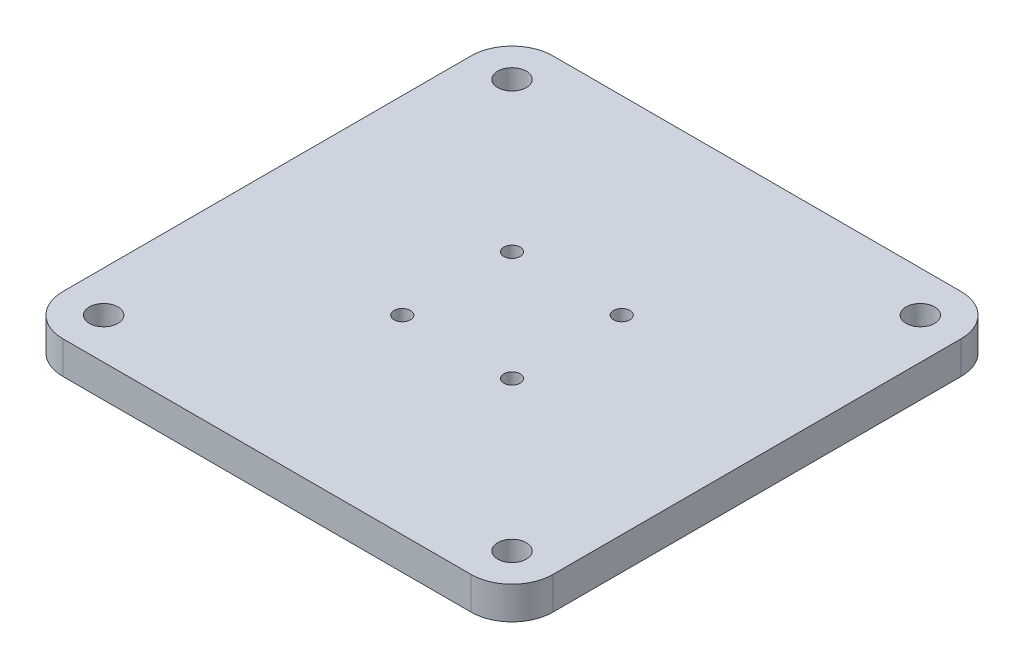
ISO-10303-21;
HEADER;
FILE_DESCRIPTION(('STEP AP214'),'2;1');
FILE_NAME('part.step','',(''),(''),'','','');
FILE_SCHEMA(('AUTOMOTIVE_DESIGN { 1 0 10303 214 1 1 1 1 }'));
ENDSEC;
DATA;
#1=APPLICATION_CONTEXT('core data for automotive mechanical design processes');
#2=APPLICATION_PROTOCOL_DEFINITION('international standard','automotive_design',2000,#1);
#3=PRODUCT_CONTEXT('',#1,'mechanical');
#4=PRODUCT('Part','Part','',(#3));
#5=PRODUCT_RELATED_PRODUCT_CATEGORY('part','',(#4));
#6=PRODUCT_DEFINITION_FORMATION('','',#4);
#7=PRODUCT_DEFINITION_CONTEXT('part definition',#1,'design');
#8=PRODUCT_DEFINITION('design','',#6,#7);
#9=PRODUCT_DEFINITION_SHAPE('','',#8);
#10=(LENGTH_UNIT() NAMED_UNIT(*) SI_UNIT(.MILLI.,.METRE.));
#11=(NAMED_UNIT(*) PLANE_ANGLE_UNIT() SI_UNIT($,.RADIAN.));
#12=(NAMED_UNIT(*) SI_UNIT($,.STERADIAN.) SOLID_ANGLE_UNIT());
#13=UNCERTAINTY_MEASURE_WITH_UNIT(LENGTH_MEASURE(1.E-05),#10,'distance_accuracy_value','');
#14=(GEOMETRIC_REPRESENTATION_CONTEXT(3) GLOBAL_UNCERTAINTY_ASSIGNED_CONTEXT((#13)) GLOBAL_UNIT_ASSIGNED_CONTEXT((#10,
#11,#12)) REPRESENTATION_CONTEXT('',''));
#15=CARTESIAN_POINT('',(0.,0.,0.));
#16=DIRECTION('',(0.,0.,1.));
#17=DIRECTION('',(1.,0.,0.));
#18=AXIS2_PLACEMENT_3D('',#15,#16,#17);
#19=CARTESIAN_POINT('',(-13.4350288425443,8.,-13.4350288425445));
#20=DIRECTION('',(0.,-1.,0.));
#21=DIRECTION('',(0.,0.,-1.));
#22=AXIS2_PLACEMENT_3D('',#19,#20,#21);
#23=CYLINDRICAL_SURFACE('',#22,2.);
#24=CARTESIAN_POINT('',(-13.4350288425443,8.,-13.4350288425445));
#25=DIRECTION('',(0.,1.,0.));
#26=DIRECTION('',(0.,0.,1.));
#27=AXIS2_PLACEMENT_3D('',#24,#25,#26);
#28=CIRCLE('',#27,2.);
#29=CARTESIAN_POINT('',(-13.4350288425443,8.,-11.4350288425445));
#30=VERTEX_POINT('',#29);
#31=EDGE_CURVE('E128',#30,#30,#28,.T.);
#32=ORIENTED_EDGE('',*,*,#31,.T.);
#33=EDGE_LOOP('',(#32));
#34=FACE_BOUND('',#33,.T.);
#35=CARTESIAN_POINT('',(-13.4350288425443,4.,-13.4350288425445));
#36=DIRECTION('',(0.,-1.,0.));
#37=DIRECTION('',(0.,0.,-1.));
#38=AXIS2_PLACEMENT_3D('',#35,#36,#37);
#39=CIRCLE('',#38,2.);
#40=CARTESIAN_POINT('',(-13.4350288425443,4.,-15.4350288425445));
#41=VERTEX_POINT('',#40);
#42=EDGE_CURVE('E167',#41,#41,#39,.T.);
#43=ORIENTED_EDGE('',*,*,#42,.T.);
#44=EDGE_LOOP('',(#43));
#45=FACE_BOUND('',#44,.T.);
#46=ADVANCED_FACE('F35',(#34,#45),#23,.F.);
#47=CARTESIAN_POINT('',(13.4350288425445,8.,-13.4350288425451));
#48=DIRECTION('',(0.,-1.,0.));
#49=DIRECTION('',(0.,0.,-1.));
#50=AXIS2_PLACEMENT_3D('',#47,#48,#49);
#51=CYLINDRICAL_SURFACE('',#50,2.00000000000078);
#52=CARTESIAN_POINT('',(13.4350288425445,8.,-13.4350288425451));
#53=DIRECTION('',(0.,1.,0.));
#54=DIRECTION('',(0.,0.,1.));
#55=AXIS2_PLACEMENT_3D('',#52,#53,#54);
#56=CIRCLE('',#55,2.00000000000078);
#57=CARTESIAN_POINT('',(13.4350288425445,8.,-11.4350288425443));
#58=VERTEX_POINT('',#57);
#59=EDGE_CURVE('E134',#58,#58,#56,.T.);
#60=ORIENTED_EDGE('',*,*,#59,.T.);
#61=EDGE_LOOP('',(#60));
#62=FACE_BOUND('',#61,.T.);
#63=CARTESIAN_POINT('',(13.4350288425445,4.,-13.4350288425451));
#64=DIRECTION('',(0.,-1.,0.));
#65=DIRECTION('',(0.,0.,-1.));
#66=AXIS2_PLACEMENT_3D('',#63,#64,#65);
#67=CIRCLE('',#66,2.00000000000078);
#68=CARTESIAN_POINT('',(13.4350288425445,4.,-15.4350288425459));
#69=VERTEX_POINT('',#68);
#70=EDGE_CURVE('E164',#69,#69,#67,.T.);
#71=ORIENTED_EDGE('',*,*,#70,.T.);
#72=EDGE_LOOP('',(#71));
#73=FACE_BOUND('',#72,.T.);
#74=ADVANCED_FACE('F292',(#62,#73),#51,.F.);
#75=CARTESIAN_POINT('',(13.4350288425451,8.,13.4350288425437));
#76=DIRECTION('',(0.,-1.,0.));
#77=DIRECTION('',(0.,0.,-1.));
#78=AXIS2_PLACEMENT_3D('',#75,#76,#77);
#79=CYLINDRICAL_SURFACE('',#78,2.00000000000106);
#80=CARTESIAN_POINT('',(13.4350288425451,8.,13.4350288425437));
#81=DIRECTION('',(0.,1.,0.));
#82=DIRECTION('',(0.,0.,1.));
#83=AXIS2_PLACEMENT_3D('',#80,#81,#82);
#84=CIRCLE('',#83,2.00000000000106);
#85=CARTESIAN_POINT('',(13.4350288425451,8.,15.4350288425448));
#86=VERTEX_POINT('',#85);
#87=EDGE_CURVE('E211',#86,#86,#84,.T.);
#88=ORIENTED_EDGE('',*,*,#87,.T.);
#89=EDGE_LOOP('',(#88));
#90=FACE_BOUND('',#89,.T.);
#91=CARTESIAN_POINT('',(13.4350288425451,4.,13.4350288425437));
#92=DIRECTION('',(0.,-1.,0.));
#93=DIRECTION('',(0.,0.,-1.));
#94=AXIS2_PLACEMENT_3D('',#91,#92,#93);
#95=CIRCLE('',#94,2.00000000000106);
#96=CARTESIAN_POINT('',(13.4350288425451,4.,11.4350288425427));
#97=VERTEX_POINT('',#96);
#98=EDGE_CURVE('E160',#97,#97,#95,.T.);
#99=ORIENTED_EDGE('',*,*,#98,.T.);
#100=EDGE_LOOP('',(#99));
#101=FACE_BOUND('',#100,.T.);
#102=ADVANCED_FACE('F298',(#90,#101),#79,.F.);
#103=CARTESIAN_POINT('',(-13.4350288425437,8.,13.4350288425443));
#104=DIRECTION('',(0.,-1.,0.));
#105=DIRECTION('',(0.,0.,-1.));
#106=AXIS2_PLACEMENT_3D('',#103,#104,#105);
#107=CYLINDRICAL_SURFACE('',#106,2.0000000000004);
#108=CARTESIAN_POINT('',(-13.4350288425437,8.,13.4350288425443));
#109=DIRECTION('',(0.,1.,0.));
#110=DIRECTION('',(0.,0.,1.));
#111=AXIS2_PLACEMENT_3D('',#108,#109,#110);
#112=CIRCLE('',#111,2.0000000000004);
#113=CARTESIAN_POINT('',(-13.4350288425437,8.,15.4350288425447));
#114=VERTEX_POINT('',#113);
#115=EDGE_CURVE('E156',#114,#114,#112,.T.);
#116=ORIENTED_EDGE('',*,*,#115,.T.);
#117=EDGE_LOOP('',(#116));
#118=FACE_BOUND('',#117,.T.);
#119=CARTESIAN_POINT('',(-13.4350288425437,4.,13.4350288425443));
#120=DIRECTION('',(0.,-1.,0.));
#121=DIRECTION('',(0.,0.,-1.));
#122=AXIS2_PLACEMENT_3D('',#119,#120,#121);
#123=CIRCLE('',#122,2.0000000000004);
#124=CARTESIAN_POINT('',(-13.4350288425437,4.,11.4350288425439));
#125=VERTEX_POINT('',#124);
#126=EDGE_CURVE('E157',#125,#125,#123,.T.);
#127=ORIENTED_EDGE('',*,*,#126,.T.);
#128=EDGE_LOOP('',(#127));
#129=FACE_BOUND('',#128,.T.);
#130=ADVANCED_FACE('F305',(#118,#129),#107,.F.);
#131=CARTESIAN_POINT('',(0.,8.,0.));
#132=DIRECTION('',(0.,1.,0.));
#133=DIRECTION('',(0.,0.,1.));
#134=AXIS2_PLACEMENT_3D('',#131,#132,#133);
#135=PLANE('',#134);
#136=CARTESIAN_POINT('',(-50.,8.,50.));
#137=DIRECTION('',(0.,1.,0.));
#138=DIRECTION('',(0.,0.,-1.));
#139=AXIS2_PLACEMENT_3D('',#136,#137,#138);
#140=CIRCLE('',#139,3.5);
#141=CARTESIAN_POINT('',(-50.,8.,46.5));
#142=VERTEX_POINT('',#141);
#143=EDGE_CURVE('E170',#142,#142,#140,.T.);
#144=ORIENTED_EDGE('',*,*,#143,.F.);
#145=EDGE_LOOP('',(#144));
#146=FACE_BOUND('',#145,.T.);
#147=CARTESIAN_POINT('',(50.,8.,50.));
#148=DIRECTION('',(0.,1.,0.));
#149=DIRECTION('',(0.,0.,1.));
#150=AXIS2_PLACEMENT_3D('',#147,#148,#149);
#151=CIRCLE('',#150,3.5);
#152=CARTESIAN_POINT('',(50.,8.,53.5));
#153=VERTEX_POINT('',#152);
#154=EDGE_CURVE('E221',#153,#153,#151,.T.);
#155=ORIENTED_EDGE('',*,*,#154,.F.);
#156=EDGE_LOOP('',(#155));
#157=FACE_BOUND('',#156,.T.);
#158=CARTESIAN_POINT('',(50.,8.,-50.));
#159=DIRECTION('',(0.,1.,0.));
#160=DIRECTION('',(0.,0.,-1.));
#161=AXIS2_PLACEMENT_3D('',#158,#159,#160);
#162=CIRCLE('',#161,3.5);
#163=CARTESIAN_POINT('',(50.,8.,-53.5));
#164=VERTEX_POINT('',#163);
#165=EDGE_CURVE('E218',#164,#164,#162,.T.);
#166=ORIENTED_EDGE('',*,*,#165,.F.);
#167=EDGE_LOOP('',(#166));
#168=FACE_BOUND('',#167,.T.);
#169=CARTESIAN_POINT('',(-50.,8.,-50.));
#170=DIRECTION('',(0.,1.,0.));
#171=DIRECTION('',(0.,0.,1.));
#172=AXIS2_PLACEMENT_3D('',#169,#170,#171);
#173=CIRCLE('',#172,3.5);
#174=CARTESIAN_POINT('',(-50.,8.,-46.5));
#175=VERTEX_POINT('',#174);
#176=EDGE_CURVE('E147',#175,#175,#173,.T.);
#177=ORIENTED_EDGE('',*,*,#176,.F.);
#178=EDGE_LOOP('',(#177));
#179=FACE_BOUND('',#178,.T.);
#180=ORIENTED_EDGE('',*,*,#87,.F.);
#181=EDGE_LOOP('',(#180));
#182=FACE_BOUND('',#181,.T.);
#183=ORIENTED_EDGE('',*,*,#31,.F.);
#184=EDGE_LOOP('',(#183));
#185=FACE_BOUND('',#184,.T.);
#186=DIRECTION('',(1.,0.,0.));
#187=VECTOR('',#186,1.);
#188=CARTESIAN_POINT('',(-60.,8.,60.));
#189=LINE('',#188,#187);
#190=CARTESIAN_POINT('',(-50.,8.,60.));
#191=VERTEX_POINT('',#190);
#192=CARTESIAN_POINT('',(50.,8.,60.));
#193=VERTEX_POINT('',#192);
#194=EDGE_CURVE('E137',#191,#193,#189,.T.);
#195=ORIENTED_EDGE('',*,*,#194,.T.);
#196=CARTESIAN_POINT('',(50.,8.,50.));
#197=DIRECTION('',(0.,1.,0.));
#198=DIRECTION('',(0.,0.,1.));
#199=AXIS2_PLACEMENT_3D('',#196,#197,#198);
#200=CIRCLE('',#199,10.);
#201=CARTESIAN_POINT('',(60.,8.,50.));
#202=VERTEX_POINT('',#201);
#203=EDGE_CURVE('E184',#193,#202,#200,.T.);
#204=ORIENTED_EDGE('',*,*,#203,.T.);
#205=DIRECTION('',(0.,0.,-1.));
#206=VECTOR('',#205,1.);
#207=CARTESIAN_POINT('',(60.,8.,-60.));
#208=LINE('',#207,#206);
#209=CARTESIAN_POINT('',(60.,8.,-50.));
#210=VERTEX_POINT('',#209);
#211=EDGE_CURVE('E121',#202,#210,#208,.T.);
#212=ORIENTED_EDGE('',*,*,#211,.T.);
#213=CARTESIAN_POINT('',(50.,8.,-50.));
#214=DIRECTION('',(0.,1.,0.));
#215=DIRECTION('',(0.,0.,1.));
#216=AXIS2_PLACEMENT_3D('',#213,#214,#215);
#217=CIRCLE('',#216,10.);
#218=CARTESIAN_POINT('',(50.,8.,-60.));
#219=VERTEX_POINT('',#218);
#220=EDGE_CURVE('E179',#210,#219,#217,.T.);
#221=ORIENTED_EDGE('',*,*,#220,.T.);
#222=DIRECTION('',(-1.,0.,0.));
#223=VECTOR('',#222,1.);
#224=CARTESIAN_POINT('',(-60.,8.,-60.));
#225=LINE('',#224,#223);
#226=CARTESIAN_POINT('',(-50.,8.,-60.));
#227=VERTEX_POINT('',#226);
#228=EDGE_CURVE('E195',#219,#227,#225,.T.);
#229=ORIENTED_EDGE('',*,*,#228,.T.);
#230=CARTESIAN_POINT('',(-50.,8.,-50.));
#231=DIRECTION('',(0.,1.,0.));
#232=DIRECTION('',(0.,0.,1.));
#233=AXIS2_PLACEMENT_3D('',#230,#231,#232);
#234=CIRCLE('',#233,10.);
#235=CARTESIAN_POINT('',(-60.,8.,-50.));
#236=VERTEX_POINT('',#235);
#237=EDGE_CURVE('E57',#227,#236,#234,.T.);
#238=ORIENTED_EDGE('',*,*,#237,.T.);
#239=DIRECTION('',(0.,0.,1.));
#240=VECTOR('',#239,1.);
#241=CARTESIAN_POINT('',(-60.,8.,-60.));
#242=LINE('',#241,#240);
#243=CARTESIAN_POINT('',(-60.,8.,50.));
#244=VERTEX_POINT('',#243);
#245=EDGE_CURVE('E203',#236,#244,#242,.T.);
#246=ORIENTED_EDGE('',*,*,#245,.T.);
#247=CARTESIAN_POINT('',(-50.,8.,50.));
#248=DIRECTION('',(0.,1.,0.));
#249=DIRECTION('',(0.,0.,1.));
#250=AXIS2_PLACEMENT_3D('',#247,#248,#249);
#251=CIRCLE('',#250,10.);
#252=EDGE_CURVE('E182',#244,#191,#251,.T.);
#253=ORIENTED_EDGE('',*,*,#252,.T.);
#254=EDGE_LOOP('',(#195,#204,#212,#221,#229,#238,#246,#253));
#255=FACE_BOUND('',#254,.T.);
#256=ORIENTED_EDGE('',*,*,#59,.F.);
#257=EDGE_LOOP('',(#256));
#258=FACE_BOUND('',#257,.T.);
#259=ORIENTED_EDGE('',*,*,#115,.F.);
#260=EDGE_LOOP('',(#259));
#261=FACE_BOUND('',#260,.T.);
#262=ADVANCED_FACE('F261',(#146,#157,#168,#179,#182,#185,#255,#258,#261),#135,.T.);
#263=CARTESIAN_POINT('',(0.,0.,0.));
#264=DIRECTION('',(0.,1.,0.));
#265=DIRECTION('',(0.,0.,1.));
#266=AXIS2_PLACEMENT_3D('',#263,#264,#265);
#267=PLANE('',#266);
#268=CARTESIAN_POINT('',(13.4350288425451,0.,13.4350288425437));
#269=DIRECTION('',(0.,-1.,0.));
#270=DIRECTION('',(0.,0.,-1.));
#271=AXIS2_PLACEMENT_3D('',#268,#269,#270);
#272=CIRCLE('',#271,3.5);
#273=CARTESIAN_POINT('',(13.4350288425451,0.,9.93502884254371));
#274=VERTEX_POINT('',#273);
#275=EDGE_CURVE('E239',#274,#274,#272,.T.);
#276=ORIENTED_EDGE('',*,*,#275,.F.);
#277=EDGE_LOOP('',(#276));
#278=FACE_BOUND('',#277,.T.);
#279=CARTESIAN_POINT('',(-13.4350288425443,0.,-13.4350288425445));
#280=DIRECTION('',(0.,-1.,0.));
#281=DIRECTION('',(0.,0.,-1.));
#282=AXIS2_PLACEMENT_3D('',#279,#280,#281);
#283=CIRCLE('',#282,3.5);
#284=CARTESIAN_POINT('',(-13.4350288425443,0.,-16.9350288425445));
#285=VERTEX_POINT('',#284);
#286=EDGE_CURVE('E232',#285,#285,#283,.T.);
#287=ORIENTED_EDGE('',*,*,#286,.F.);
#288=EDGE_LOOP('',(#287));
#289=FACE_BOUND('',#288,.T.);
#290=CARTESIAN_POINT('',(13.4350288425445,0.,-13.4350288425451));
#291=DIRECTION('',(0.,-1.,0.));
#292=DIRECTION('',(0.,0.,-1.));
#293=AXIS2_PLACEMENT_3D('',#290,#291,#292);
#294=CIRCLE('',#293,3.5);
#295=CARTESIAN_POINT('',(13.4350288425445,0.,-16.9350288425451));
#296=VERTEX_POINT('',#295);
#297=EDGE_CURVE('E244',#296,#296,#294,.T.);
#298=ORIENTED_EDGE('',*,*,#297,.F.);
#299=EDGE_LOOP('',(#298));
#300=FACE_BOUND('',#299,.T.);
#301=CARTESIAN_POINT('',(-13.4350288425437,0.,13.4350288425443));
#302=DIRECTION('',(0.,-1.,0.));
#303=DIRECTION('',(0.,0.,-1.));
#304=AXIS2_PLACEMENT_3D('',#301,#302,#303);
#305=CIRCLE('',#304,3.5);
#306=CARTESIAN_POINT('',(-13.4350288425437,0.,9.93502884254433));
#307=VERTEX_POINT('',#306);
#308=EDGE_CURVE('E226',#307,#307,#305,.T.);
#309=ORIENTED_EDGE('',*,*,#308,.F.);
#310=EDGE_LOOP('',(#309));
#311=FACE_BOUND('',#310,.T.);
#312=CARTESIAN_POINT('',(-50.,0.,50.));
#313=DIRECTION('',(0.,1.,0.));
#314=DIRECTION('',(0.,0.,1.));
#315=AXIS2_PLACEMENT_3D('',#312,#313,#314);
#316=CIRCLE('',#315,3.5);
#317=CARTESIAN_POINT('',(-50.,0.,53.5));
#318=VERTEX_POINT('',#317);
#319=EDGE_CURVE('E153',#318,#318,#316,.T.);
#320=ORIENTED_EDGE('',*,*,#319,.T.);
#321=EDGE_LOOP('',(#320));
#322=FACE_BOUND('',#321,.T.);
#323=CARTESIAN_POINT('',(50.,0.,50.));
#324=DIRECTION('',(0.,1.,0.));
#325=DIRECTION('',(0.,0.,1.));
#326=AXIS2_PLACEMENT_3D('',#323,#324,#325);
#327=CIRCLE('',#326,3.5);
#328=CARTESIAN_POINT('',(50.,0.,53.5));
#329=VERTEX_POINT('',#328);
#330=EDGE_CURVE('E150',#329,#329,#327,.T.);
#331=ORIENTED_EDGE('',*,*,#330,.T.);
#332=EDGE_LOOP('',(#331));
#333=FACE_BOUND('',#332,.T.);
#334=CARTESIAN_POINT('',(50.,0.,-50.));
#335=DIRECTION('',(0.,1.,0.));
#336=DIRECTION('',(0.,0.,1.));
#337=AXIS2_PLACEMENT_3D('',#334,#335,#336);
#338=CIRCLE('',#337,3.5);
#339=CARTESIAN_POINT('',(50.,0.,-46.5));
#340=VERTEX_POINT('',#339);
#341=EDGE_CURVE('E146',#340,#340,#338,.T.);
#342=ORIENTED_EDGE('',*,*,#341,.T.);
#343=EDGE_LOOP('',(#342));
#344=FACE_BOUND('',#343,.T.);
#345=CARTESIAN_POINT('',(-50.,0.,-50.));
#346=DIRECTION('',(0.,1.,0.));
#347=DIRECTION('',(0.,0.,1.));
#348=AXIS2_PLACEMENT_3D('',#345,#346,#347);
#349=CIRCLE('',#348,3.5);
#350=CARTESIAN_POINT('',(-50.,0.,-46.5));
#351=VERTEX_POINT('',#350);
#352=EDGE_CURVE('E143',#351,#351,#349,.T.);
#353=ORIENTED_EDGE('',*,*,#352,.T.);
#354=EDGE_LOOP('',(#353));
#355=FACE_BOUND('',#354,.T.);
#356=DIRECTION('',(0.,0.,-1.));
#357=VECTOR('',#356,1.);
#358=CARTESIAN_POINT('',(60.,0.,-60.));
#359=LINE('',#358,#357);
#360=CARTESIAN_POINT('',(60.,0.,50.));
#361=VERTEX_POINT('',#360);
#362=CARTESIAN_POINT('',(60.,0.,-50.));
#363=VERTEX_POINT('',#362);
#364=EDGE_CURVE('E118',#361,#363,#359,.T.);
#365=ORIENTED_EDGE('',*,*,#364,.F.);
#366=CARTESIAN_POINT('',(50.,0.,50.));
#367=DIRECTION('',(0.,1.,0.));
#368=DIRECTION('',(0.,0.,1.));
#369=AXIS2_PLACEMENT_3D('',#366,#367,#368);
#370=CIRCLE('',#369,10.);
#371=CARTESIAN_POINT('',(50.,0.,60.));
#372=VERTEX_POINT('',#371);
#373=EDGE_CURVE('E101',#361,#372,#370,.F.);
#374=ORIENTED_EDGE('',*,*,#373,.T.);
#375=DIRECTION('',(1.,0.,0.));
#376=VECTOR('',#375,1.);
#377=CARTESIAN_POINT('',(-60.,0.,60.));
#378=LINE('',#377,#376);
#379=CARTESIAN_POINT('',(-50.,0.,60.));
#380=VERTEX_POINT('',#379);
#381=EDGE_CURVE('E141',#380,#372,#378,.T.);
#382=ORIENTED_EDGE('',*,*,#381,.F.);
#383=CARTESIAN_POINT('',(-50.,0.,50.));
#384=DIRECTION('',(0.,1.,0.));
#385=DIRECTION('',(0.,0.,1.));
#386=AXIS2_PLACEMENT_3D('',#383,#384,#385);
#387=CIRCLE('',#386,10.);
#388=CARTESIAN_POINT('',(-60.,0.,50.));
#389=VERTEX_POINT('',#388);
#390=EDGE_CURVE('E112',#380,#389,#387,.F.);
#391=ORIENTED_EDGE('',*,*,#390,.T.);
#392=DIRECTION('',(0.,0.,1.));
#393=VECTOR('',#392,1.);
#394=CARTESIAN_POINT('',(-60.,0.,-60.));
#395=LINE('',#394,#393);
#396=CARTESIAN_POINT('',(-60.,0.,-50.));
#397=VERTEX_POINT('',#396);
#398=EDGE_CURVE('E131',#397,#389,#395,.T.);
#399=ORIENTED_EDGE('',*,*,#398,.F.);
#400=CARTESIAN_POINT('',(-50.,0.,-50.));
#401=DIRECTION('',(0.,1.,0.));
#402=DIRECTION('',(0.,0.,1.));
#403=AXIS2_PLACEMENT_3D('',#400,#401,#402);
#404=CIRCLE('',#403,10.);
#405=CARTESIAN_POINT('',(-50.,0.,-60.));
#406=VERTEX_POINT('',#405);
#407=EDGE_CURVE('E173',#397,#406,#404,.F.);
#408=ORIENTED_EDGE('',*,*,#407,.T.);
#409=DIRECTION('',(-1.,0.,0.));
#410=VECTOR('',#409,1.);
#411=CARTESIAN_POINT('',(-60.,0.,-60.));
#412=LINE('',#411,#410);
#413=CARTESIAN_POINT('',(50.,0.,-60.));
#414=VERTEX_POINT('',#413);
#415=EDGE_CURVE('E127',#414,#406,#412,.T.);
#416=ORIENTED_EDGE('',*,*,#415,.F.);
#417=CARTESIAN_POINT('',(50.,0.,-50.));
#418=DIRECTION('',(0.,1.,0.));
#419=DIRECTION('',(0.,0.,1.));
#420=AXIS2_PLACEMENT_3D('',#417,#418,#419);
#421=CIRCLE('',#420,10.);
#422=EDGE_CURVE('E122',#414,#363,#421,.F.);
#423=ORIENTED_EDGE('',*,*,#422,.T.);
#424=EDGE_LOOP('',(#365,#374,#382,#391,#399,#408,#416,#423));
#425=FACE_BOUND('',#424,.T.);
#426=ADVANCED_FACE('F125',(#278,#289,#300,#311,#322,#333,#344,#355,#425),#267,.F.);
#427=CARTESIAN_POINT('',(60.,8.,-60.));
#428=DIRECTION('',(-1.,0.,0.));
#429=DIRECTION('',(0.,0.,1.));
#430=AXIS2_PLACEMENT_3D('',#427,#428,#429);
#431=PLANE('',#430);
#432=ORIENTED_EDGE('',*,*,#211,.F.);
#433=DIRECTION('',(0.,-1.,0.));
#434=VECTOR('',#433,1.);
#435=CARTESIAN_POINT('',(60.,8.,50.));
#436=LINE('',#435,#434);
#437=EDGE_CURVE('E105',#202,#361,#436,.T.);
#438=ORIENTED_EDGE('',*,*,#437,.T.);
#439=ORIENTED_EDGE('',*,*,#364,.T.);
#440=DIRECTION('',(0.,-1.,0.));
#441=VECTOR('',#440,1.);
#442=CARTESIAN_POINT('',(60.,8.,-50.));
#443=LINE('',#442,#441);
#444=EDGE_CURVE('E123',#363,#210,#443,.F.);
#445=ORIENTED_EDGE('',*,*,#444,.T.);
#446=EDGE_LOOP('',(#432,#438,#439,#445));
#447=FACE_BOUND('',#446,.T.);
#448=ADVANCED_FACE('F117',(#447),#431,.F.);
#449=CARTESIAN_POINT('',(-60.,8.,-60.));
#450=DIRECTION('',(0.,0.,1.));
#451=DIRECTION('',(1.,0.,0.));
#452=AXIS2_PLACEMENT_3D('',#449,#450,#451);
#453=PLANE('',#452);
#454=ORIENTED_EDGE('',*,*,#415,.T.);
#455=DIRECTION('',(0.,-1.,0.));
#456=VECTOR('',#455,1.);
#457=CARTESIAN_POINT('',(-50.,8.,-60.));
#458=LINE('',#457,#456);
#459=EDGE_CURVE('E11',#406,#227,#458,.F.);
#460=ORIENTED_EDGE('',*,*,#459,.T.);
#461=ORIENTED_EDGE('',*,*,#228,.F.);
#462=DIRECTION('',(0.,-1.,0.));
#463=VECTOR('',#462,1.);
#464=CARTESIAN_POINT('',(50.,8.,-60.));
#465=LINE('',#464,#463);
#466=EDGE_CURVE('E43',#219,#414,#465,.T.);
#467=ORIENTED_EDGE('',*,*,#466,.T.);
#468=EDGE_LOOP('',(#454,#460,#461,#467));
#469=FACE_BOUND('',#468,.T.);
#470=ADVANCED_FACE('F193',(#469),#453,.F.);
#471=CARTESIAN_POINT('',(-60.,8.,-60.));
#472=DIRECTION('',(1.,0.,0.));
#473=DIRECTION('',(0.,0.,-1.));
#474=AXIS2_PLACEMENT_3D('',#471,#472,#473);
#475=PLANE('',#474);
#476=ORIENTED_EDGE('',*,*,#398,.T.);
#477=DIRECTION('',(0.,-1.,0.));
#478=VECTOR('',#477,1.);
#479=CARTESIAN_POINT('',(-60.,8.,50.));
#480=LINE('',#479,#478);
#481=EDGE_CURVE('E50',#389,#244,#480,.F.);
#482=ORIENTED_EDGE('',*,*,#481,.T.);
#483=ORIENTED_EDGE('',*,*,#245,.F.);
#484=DIRECTION('',(0.,-1.,0.));
#485=VECTOR('',#484,1.);
#486=CARTESIAN_POINT('',(-60.,8.,-50.));
#487=LINE('',#486,#485);
#488=EDGE_CURVE('E186',#236,#397,#487,.T.);
#489=ORIENTED_EDGE('',*,*,#488,.T.);
#490=EDGE_LOOP('',(#476,#482,#483,#489));
#491=FACE_BOUND('',#490,.T.);
#492=ADVANCED_FACE('F202',(#491),#475,.F.);
#493=CARTESIAN_POINT('',(-60.,8.,60.));
#494=DIRECTION('',(0.,0.,-1.));
#495=DIRECTION('',(-1.,0.,0.));
#496=AXIS2_PLACEMENT_3D('',#493,#494,#495);
#497=PLANE('',#496);
#498=ORIENTED_EDGE('',*,*,#381,.T.);
#499=DIRECTION('',(0.,-1.,0.));
#500=VECTOR('',#499,1.);
#501=CARTESIAN_POINT('',(50.,8.,60.));
#502=LINE('',#501,#500);
#503=EDGE_CURVE('E106',#372,#193,#502,.F.);
#504=ORIENTED_EDGE('',*,*,#503,.T.);
#505=ORIENTED_EDGE('',*,*,#194,.F.);
#506=DIRECTION('',(0.,-1.,0.));
#507=VECTOR('',#506,1.);
#508=CARTESIAN_POINT('',(-50.,8.,60.));
#509=LINE('',#508,#507);
#510=EDGE_CURVE('E111',#191,#380,#509,.T.);
#511=ORIENTED_EDGE('',*,*,#510,.T.);
#512=EDGE_LOOP('',(#498,#504,#505,#511));
#513=FACE_BOUND('',#512,.T.);
#514=ADVANCED_FACE('F277',(#513),#497,.F.);
#515=CARTESIAN_POINT('',(-50.,-2.,-50.));
#516=DIRECTION('',(0.,1.,0.));
#517=DIRECTION('',(0.,0.,1.));
#518=AXIS2_PLACEMENT_3D('',#515,#516,#517);
#519=CYLINDRICAL_SURFACE('',#518,3.5);
#520=ORIENTED_EDGE('',*,*,#176,.T.);
#521=EDGE_LOOP('',(#520));
#522=FACE_BOUND('',#521,.T.);
#523=ORIENTED_EDGE('',*,*,#352,.F.);
#524=EDGE_LOOP('',(#523));
#525=FACE_BOUND('',#524,.T.);
#526=ADVANCED_FACE('F274',(#522,#525),#519,.F.);
#527=CARTESIAN_POINT('',(50.,-2.,-50.));
#528=DIRECTION('',(0.,1.,0.));
#529=DIRECTION('',(0.,0.,1.));
#530=AXIS2_PLACEMENT_3D('',#527,#528,#529);
#531=CYLINDRICAL_SURFACE('',#530,3.5);
#532=ORIENTED_EDGE('',*,*,#165,.T.);
#533=EDGE_LOOP('',(#532));
#534=FACE_BOUND('',#533,.T.);
#535=ORIENTED_EDGE('',*,*,#341,.F.);
#536=EDGE_LOOP('',(#535));
#537=FACE_BOUND('',#536,.T.);
#538=ADVANCED_FACE('F276',(#534,#537),#531,.F.);
#539=CARTESIAN_POINT('',(50.,-2.,50.));
#540=DIRECTION('',(0.,1.,0.));
#541=DIRECTION('',(0.,0.,1.));
#542=AXIS2_PLACEMENT_3D('',#539,#540,#541);
#543=CYLINDRICAL_SURFACE('',#542,3.5);
#544=ORIENTED_EDGE('',*,*,#154,.T.);
#545=EDGE_LOOP('',(#544));
#546=FACE_BOUND('',#545,.T.);
#547=ORIENTED_EDGE('',*,*,#330,.F.);
#548=EDGE_LOOP('',(#547));
#549=FACE_BOUND('',#548,.T.);
#550=ADVANCED_FACE('F284',(#546,#549),#543,.F.);
#551=CARTESIAN_POINT('',(-50.,-2.,50.));
#552=DIRECTION('',(0.,1.,0.));
#553=DIRECTION('',(0.,0.,1.));
#554=AXIS2_PLACEMENT_3D('',#551,#552,#553);
#555=CYLINDRICAL_SURFACE('',#554,3.5);
#556=ORIENTED_EDGE('',*,*,#143,.T.);
#557=EDGE_LOOP('',(#556));
#558=FACE_BOUND('',#557,.T.);
#559=ORIENTED_EDGE('',*,*,#319,.F.);
#560=EDGE_LOOP('',(#559));
#561=FACE_BOUND('',#560,.T.);
#562=ADVANCED_FACE('F347',(#558,#561),#555,.F.);
#563=CARTESIAN_POINT('',(-13.4350288425437,4.,13.4350288425443));
#564=DIRECTION('',(0.,-1.,0.));
#565=DIRECTION('',(0.,0.,-1.));
#566=AXIS2_PLACEMENT_3D('',#563,#564,#565);
#567=CYLINDRICAL_SURFACE('',#566,3.5);
#568=CARTESIAN_POINT('',(-13.4350288425437,4.,13.4350288425443));
#569=DIRECTION('',(0.,-1.,0.));
#570=DIRECTION('',(0.,0.,-1.));
#571=AXIS2_PLACEMENT_3D('',#568,#569,#570);
#572=CIRCLE('',#571,3.5);
#573=CARTESIAN_POINT('',(-13.4350288425437,4.,9.93502884254433));
#574=VERTEX_POINT('',#573);
#575=EDGE_CURVE('E161',#574,#574,#572,.T.);
#576=ORIENTED_EDGE('',*,*,#575,.F.);
#577=EDGE_LOOP('',(#576));
#578=FACE_BOUND('',#577,.T.);
#579=ORIENTED_EDGE('',*,*,#308,.T.);
#580=EDGE_LOOP('',(#579));
#581=FACE_BOUND('',#580,.T.);
#582=ADVANCED_FACE('F341',(#578,#581),#567,.F.);
#583=CARTESIAN_POINT('',(-13.4350288425437,4.,13.4350288425443));
#584=DIRECTION('',(0.,-1.,0.));
#585=DIRECTION('',(0.,0.,-1.));
#586=AXIS2_PLACEMENT_3D('',#583,#584,#585);
#587=PLANE('',#586);
#588=ORIENTED_EDGE('',*,*,#126,.F.);
#589=EDGE_LOOP('',(#588));
#590=FACE_BOUND('',#589,.T.);
#591=ORIENTED_EDGE('',*,*,#575,.T.);
#592=EDGE_LOOP('',(#591));
#593=FACE_BOUND('',#592,.T.);
#594=ADVANCED_FACE('F337',(#590,#593),#587,.T.);
#595=CARTESIAN_POINT('',(13.4350288425451,4.,13.4350288425437));
#596=DIRECTION('',(0.,-1.,0.));
#597=DIRECTION('',(0.,0.,-1.));
#598=AXIS2_PLACEMENT_3D('',#595,#596,#597);
#599=CYLINDRICAL_SURFACE('',#598,3.5);
#600=CARTESIAN_POINT('',(13.4350288425451,4.,13.4350288425437));
#601=DIRECTION('',(0.,-1.,0.));
#602=DIRECTION('',(0.,0.,-1.));
#603=AXIS2_PLACEMENT_3D('',#600,#601,#602);
#604=CIRCLE('',#603,3.5);
#605=CARTESIAN_POINT('',(13.4350288425451,4.,9.93502884254371));
#606=VERTEX_POINT('',#605);
#607=EDGE_CURVE('E229',#606,#606,#604,.T.);
#608=ORIENTED_EDGE('',*,*,#607,.F.);
#609=EDGE_LOOP('',(#608));
#610=FACE_BOUND('',#609,.T.);
#611=ORIENTED_EDGE('',*,*,#275,.T.);
#612=EDGE_LOOP('',(#611));
#613=FACE_BOUND('',#612,.T.);
#614=ADVANCED_FACE('F340',(#610,#613),#599,.F.);
#615=CARTESIAN_POINT('',(13.4350288425451,4.,13.4350288425437));
#616=DIRECTION('',(0.,-1.,0.));
#617=DIRECTION('',(0.,0.,-1.));
#618=AXIS2_PLACEMENT_3D('',#615,#616,#617);
#619=PLANE('',#618);
#620=ORIENTED_EDGE('',*,*,#98,.F.);
#621=EDGE_LOOP('',(#620));
#622=FACE_BOUND('',#621,.T.);
#623=ORIENTED_EDGE('',*,*,#607,.T.);
#624=EDGE_LOOP('',(#623));
#625=FACE_BOUND('',#624,.T.);
#626=ADVANCED_FACE('F255',(#622,#625),#619,.T.);
#627=CARTESIAN_POINT('',(13.4350288425445,4.,-13.4350288425451));
#628=DIRECTION('',(0.,-1.,0.));
#629=DIRECTION('',(0.,0.,-1.));
#630=AXIS2_PLACEMENT_3D('',#627,#628,#629);
#631=CYLINDRICAL_SURFACE('',#630,3.5);
#632=CARTESIAN_POINT('',(13.4350288425445,4.,-13.4350288425451));
#633=DIRECTION('',(0.,-1.,0.));
#634=DIRECTION('',(0.,0.,-1.));
#635=AXIS2_PLACEMENT_3D('',#632,#633,#634);
#636=CIRCLE('',#635,3.5);
#637=CARTESIAN_POINT('',(13.4350288425445,4.,-16.9350288425451));
#638=VERTEX_POINT('',#637);
#639=EDGE_CURVE('E236',#638,#638,#636,.T.);
#640=ORIENTED_EDGE('',*,*,#639,.F.);
#641=EDGE_LOOP('',(#640));
#642=FACE_BOUND('',#641,.T.);
#643=ORIENTED_EDGE('',*,*,#297,.T.);
#644=EDGE_LOOP('',(#643));
#645=FACE_BOUND('',#644,.T.);
#646=ADVANCED_FACE('F252',(#642,#645),#631,.F.);
#647=CARTESIAN_POINT('',(13.4350288425445,4.,-13.4350288425451));
#648=DIRECTION('',(0.,-1.,0.));
#649=DIRECTION('',(0.,0.,-1.));
#650=AXIS2_PLACEMENT_3D('',#647,#648,#649);
#651=PLANE('',#650);
#652=ORIENTED_EDGE('',*,*,#70,.F.);
#653=EDGE_LOOP('',(#652));
#654=FACE_BOUND('',#653,.T.);
#655=ORIENTED_EDGE('',*,*,#639,.T.);
#656=EDGE_LOOP('',(#655));
#657=FACE_BOUND('',#656,.T.);
#658=ADVANCED_FACE('F250',(#654,#657),#651,.T.);
#659=CARTESIAN_POINT('',(-13.4350288425443,4.,-13.4350288425445));
#660=DIRECTION('',(0.,-1.,0.));
#661=DIRECTION('',(0.,0.,-1.));
#662=AXIS2_PLACEMENT_3D('',#659,#660,#661);
#663=CYLINDRICAL_SURFACE('',#662,3.5);
#664=CARTESIAN_POINT('',(-13.4350288425443,4.,-13.4350288425445));
#665=DIRECTION('',(0.,-1.,0.));
#666=DIRECTION('',(0.,0.,-1.));
#667=AXIS2_PLACEMENT_3D('',#664,#665,#666);
#668=CIRCLE('',#667,3.5);
#669=CARTESIAN_POINT('',(-13.4350288425443,4.,-16.9350288425445));
#670=VERTEX_POINT('',#669);
#671=EDGE_CURVE('E235',#670,#670,#668,.T.);
#672=ORIENTED_EDGE('',*,*,#671,.F.);
#673=EDGE_LOOP('',(#672));
#674=FACE_BOUND('',#673,.T.);
#675=ORIENTED_EDGE('',*,*,#286,.T.);
#676=EDGE_LOOP('',(#675));
#677=FACE_BOUND('',#676,.T.);
#678=ADVANCED_FACE('F387',(#674,#677),#663,.F.);
#679=CARTESIAN_POINT('',(-13.4350288425443,4.,-13.4350288425445));
#680=DIRECTION('',(0.,-1.,0.));
#681=DIRECTION('',(0.,0.,-1.));
#682=AXIS2_PLACEMENT_3D('',#679,#680,#681);
#683=PLANE('',#682);
#684=ORIENTED_EDGE('',*,*,#42,.F.);
#685=EDGE_LOOP('',(#684));
#686=FACE_BOUND('',#685,.T.);
#687=ORIENTED_EDGE('',*,*,#671,.T.);
#688=EDGE_LOOP('',(#687));
#689=FACE_BOUND('',#688,.T.);
#690=ADVANCED_FACE('F317',(#686,#689),#683,.T.);
#691=CARTESIAN_POINT('',(50.,8.,50.));
#692=DIRECTION('',(0.,-1.,0.));
#693=DIRECTION('',(0.,0.,-1.));
#694=AXIS2_PLACEMENT_3D('',#691,#692,#693);
#695=CYLINDRICAL_SURFACE('',#694,10.);
#696=ORIENTED_EDGE('',*,*,#203,.F.);
#697=ORIENTED_EDGE('',*,*,#503,.F.);
#698=ORIENTED_EDGE('',*,*,#373,.F.);
#699=ORIENTED_EDGE('',*,*,#437,.F.);
#700=EDGE_LOOP('',(#696,#697,#698,#699));
#701=FACE_BOUND('',#700,.T.);
#702=ADVANCED_FACE('F104',(#701),#695,.T.);
#703=CARTESIAN_POINT('',(-50.,8.,50.));
#704=DIRECTION('',(0.,-1.,0.));
#705=DIRECTION('',(0.,0.,-1.));
#706=AXIS2_PLACEMENT_3D('',#703,#704,#705);
#707=CYLINDRICAL_SURFACE('',#706,10.);
#708=ORIENTED_EDGE('',*,*,#252,.F.);
#709=ORIENTED_EDGE('',*,*,#481,.F.);
#710=ORIENTED_EDGE('',*,*,#390,.F.);
#711=ORIENTED_EDGE('',*,*,#510,.F.);
#712=EDGE_LOOP('',(#708,#709,#710,#711));
#713=FACE_BOUND('',#712,.T.);
#714=ADVANCED_FACE('F316',(#713),#707,.T.);
#715=CARTESIAN_POINT('',(-50.,8.,-50.));
#716=DIRECTION('',(0.,-1.,0.));
#717=DIRECTION('',(0.,0.,-1.));
#718=AXIS2_PLACEMENT_3D('',#715,#716,#717);
#719=CYLINDRICAL_SURFACE('',#718,10.);
#720=ORIENTED_EDGE('',*,*,#237,.F.);
#721=ORIENTED_EDGE('',*,*,#459,.F.);
#722=ORIENTED_EDGE('',*,*,#407,.F.);
#723=ORIENTED_EDGE('',*,*,#488,.F.);
#724=EDGE_LOOP('',(#720,#721,#722,#723));
#725=FACE_BOUND('',#724,.T.);
#726=ADVANCED_FACE('F201',(#725),#719,.T.);
#727=CARTESIAN_POINT('',(50.,8.,-50.));
#728=DIRECTION('',(0.,-1.,0.));
#729=DIRECTION('',(0.,0.,-1.));
#730=AXIS2_PLACEMENT_3D('',#727,#728,#729);
#731=CYLINDRICAL_SURFACE('',#730,10.);
#732=ORIENTED_EDGE('',*,*,#220,.F.);
#733=ORIENTED_EDGE('',*,*,#444,.F.);
#734=ORIENTED_EDGE('',*,*,#422,.F.);
#735=ORIENTED_EDGE('',*,*,#466,.F.);
#736=EDGE_LOOP('',(#732,#733,#734,#735));
#737=FACE_BOUND('',#736,.T.);
#738=ADVANCED_FACE('F37',(#737),#731,.T.);
#739=CLOSED_SHELL('',(#46,#74,#102,#130,#262,#426,#448,#470,#492,#514,#526,#538,#550,#562,#582,
#594,#614,#626,#646,#658,#678,#690,#702,#714,#726,#738));
#740=MANIFOLD_SOLID_BREP('B2',#739);
#741=ADVANCED_BREP_SHAPE_REPRESENTATION('',(#18,#740),#14);
#742=SHAPE_DEFINITION_REPRESENTATION(#9,#741);
ENDSEC;
END-ISO-10303-21;
